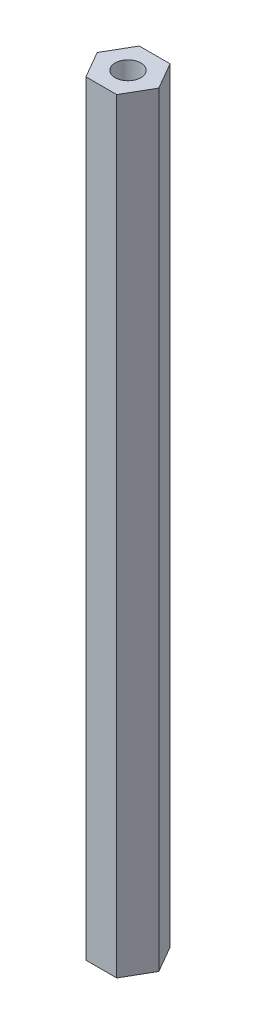
ISO-10303-21;
HEADER;
FILE_DESCRIPTION(('STEP AP214'),'2;1');
FILE_NAME('part.step','',(''),(''),'','','');
FILE_SCHEMA(('AUTOMOTIVE_DESIGN { 1 0 10303 214 1 1 1 1 }'));
ENDSEC;
DATA;
#1=APPLICATION_CONTEXT('core data for automotive mechanical design processes');
#2=APPLICATION_PROTOCOL_DEFINITION('international standard','automotive_design',2000,#1);
#3=PRODUCT_CONTEXT('',#1,'mechanical');
#4=PRODUCT('Part','Part','',(#3));
#5=PRODUCT_RELATED_PRODUCT_CATEGORY('part','',(#4));
#6=PRODUCT_DEFINITION_FORMATION('','',#4);
#7=PRODUCT_DEFINITION_CONTEXT('part definition',#1,'design');
#8=PRODUCT_DEFINITION('design','',#6,#7);
#9=PRODUCT_DEFINITION_SHAPE('','',#8);
#10=(LENGTH_UNIT() NAMED_UNIT(*) SI_UNIT(.MILLI.,.METRE.));
#11=(NAMED_UNIT(*) PLANE_ANGLE_UNIT() SI_UNIT($,.RADIAN.));
#12=(NAMED_UNIT(*) SI_UNIT($,.STERADIAN.) SOLID_ANGLE_UNIT());
#13=UNCERTAINTY_MEASURE_WITH_UNIT(LENGTH_MEASURE(1.E-05),#10,'distance_accuracy_value','');
#14=(GEOMETRIC_REPRESENTATION_CONTEXT(3) GLOBAL_UNCERTAINTY_ASSIGNED_CONTEXT((#13)) GLOBAL_UNIT_ASSIGNED_CONTEXT((#10,
#11,#12)) REPRESENTATION_CONTEXT('',''));
#15=CARTESIAN_POINT('',(0.,0.,0.));
#16=DIRECTION('',(0.,0.,1.));
#17=DIRECTION('',(1.,0.,0.));
#18=AXIS2_PLACEMENT_3D('',#15,#16,#17);
#19=CARTESIAN_POINT('',(3.,74.5,0.));
#20=DIRECTION('',(-0.866025403784439,0.,0.5));
#21=DIRECTION('',(0.5,0.,0.866025403784439));
#22=AXIS2_PLACEMENT_3D('',#19,#20,#21);
#23=PLANE('',#22);
#24=DIRECTION('',(-0.5,0.,-0.866025403784439));
#25=VECTOR('',#24,1.);
#26=CARTESIAN_POINT('',(3.,0.,0.));
#27=LINE('',#26,#25);
#28=CARTESIAN_POINT('',(3.,0.,0.));
#29=VERTEX_POINT('',#28);
#30=CARTESIAN_POINT('',(1.5,0.,-2.59807621135332));
#31=VERTEX_POINT('',#30);
#32=EDGE_CURVE('E128',#29,#31,#27,.T.);
#33=ORIENTED_EDGE('',*,*,#32,.T.);
#34=DIRECTION('',(0.,-1.,0.));
#35=VECTOR('',#34,1.);
#36=CARTESIAN_POINT('',(1.5,74.5,-2.59807621135332));
#37=LINE('',#36,#35);
#38=CARTESIAN_POINT('',(1.5,74.5,-2.59807621135332));
#39=VERTEX_POINT('',#38);
#40=EDGE_CURVE('E11',#39,#31,#37,.T.);
#41=ORIENTED_EDGE('',*,*,#40,.F.);
#42=DIRECTION('',(-0.5,0.,-0.866025403784439));
#43=VECTOR('',#42,1.);
#44=CARTESIAN_POINT('',(3.,74.5,0.));
#45=LINE('',#44,#43);
#46=CARTESIAN_POINT('',(3.,74.5,0.));
#47=VERTEX_POINT('',#46);
#48=EDGE_CURVE('E145',#47,#39,#45,.T.);
#49=ORIENTED_EDGE('',*,*,#48,.F.);
#50=DIRECTION('',(0.,-1.,0.));
#51=VECTOR('',#50,1.);
#52=CARTESIAN_POINT('',(3.,74.5,0.));
#53=LINE('',#52,#51);
#54=EDGE_CURVE('E124',#47,#29,#53,.T.);
#55=ORIENTED_EDGE('',*,*,#54,.T.);
#56=EDGE_LOOP('',(#33,#41,#49,#55));
#57=FACE_BOUND('',#56,.T.);
#58=ADVANCED_FACE('F39',(#57),#23,.F.);
#59=CARTESIAN_POINT('',(1.5,74.5,-2.59807621135332));
#60=DIRECTION('',(0.,0.,1.));
#61=DIRECTION('',(1.,0.,0.));
#62=AXIS2_PLACEMENT_3D('',#59,#60,#61);
#63=PLANE('',#62);
#64=DIRECTION('',(-1.,0.,0.));
#65=VECTOR('',#64,1.);
#66=CARTESIAN_POINT('',(1.5,0.,-2.59807621135332));
#67=LINE('',#66,#65);
#68=CARTESIAN_POINT('',(-1.5,0.,-2.59807621135332));
#69=VERTEX_POINT('',#68);
#70=EDGE_CURVE('E132',#31,#69,#67,.T.);
#71=ORIENTED_EDGE('',*,*,#70,.T.);
#72=DIRECTION('',(0.,-1.,0.));
#73=VECTOR('',#72,1.);
#74=CARTESIAN_POINT('',(-1.5,74.5,-2.59807621135332));
#75=LINE('',#74,#73);
#76=CARTESIAN_POINT('',(-1.5,74.5,-2.59807621135332));
#77=VERTEX_POINT('',#76);
#78=EDGE_CURVE('E48',#77,#69,#75,.T.);
#79=ORIENTED_EDGE('',*,*,#78,.F.);
#80=DIRECTION('',(-1.,0.,0.));
#81=VECTOR('',#80,1.);
#82=CARTESIAN_POINT('',(1.5,74.5,-2.59807621135332));
#83=LINE('',#82,#81);
#84=EDGE_CURVE('E93',#39,#77,#83,.T.);
#85=ORIENTED_EDGE('',*,*,#84,.F.);
#86=ORIENTED_EDGE('',*,*,#40,.T.);
#87=EDGE_LOOP('',(#71,#79,#85,#86));
#88=FACE_BOUND('',#87,.T.);
#89=ADVANCED_FACE('F174',(#88),#63,.F.);
#90=CARTESIAN_POINT('',(-1.5,74.5,-2.59807621135332));
#91=DIRECTION('',(0.866025403784439,0.,0.5));
#92=DIRECTION('',(0.5,0.,-0.866025403784439));
#93=AXIS2_PLACEMENT_3D('',#90,#91,#92);
#94=PLANE('',#93);
#95=DIRECTION('',(-0.5,0.,0.866025403784439));
#96=VECTOR('',#95,1.);
#97=CARTESIAN_POINT('',(-1.5,0.,-2.59807621135332));
#98=LINE('',#97,#96);
#99=CARTESIAN_POINT('',(-3.,0.,0.));
#100=VERTEX_POINT('',#99);
#101=EDGE_CURVE('E136',#69,#100,#98,.T.);
#102=ORIENTED_EDGE('',*,*,#101,.T.);
#103=DIRECTION('',(0.,-1.,0.));
#104=VECTOR('',#103,1.);
#105=CARTESIAN_POINT('',(-3.,74.5,0.));
#106=LINE('',#105,#104);
#107=CARTESIAN_POINT('',(-3.,74.5,0.));
#108=VERTEX_POINT('',#107);
#109=EDGE_CURVE('E117',#108,#100,#106,.T.);
#110=ORIENTED_EDGE('',*,*,#109,.F.);
#111=DIRECTION('',(-0.5,0.,0.866025403784439));
#112=VECTOR('',#111,1.);
#113=CARTESIAN_POINT('',(-1.5,74.5,-2.59807621135332));
#114=LINE('',#113,#112);
#115=EDGE_CURVE('E106',#77,#108,#114,.T.);
#116=ORIENTED_EDGE('',*,*,#115,.F.);
#117=ORIENTED_EDGE('',*,*,#78,.T.);
#118=EDGE_LOOP('',(#102,#110,#116,#117));
#119=FACE_BOUND('',#118,.T.);
#120=ADVANCED_FACE('F155',(#119),#94,.F.);
#121=CARTESIAN_POINT('',(-3.,74.5,0.));
#122=DIRECTION('',(0.866025403784439,0.,-0.5));
#123=DIRECTION('',(-0.5,0.,-0.866025403784439));
#124=AXIS2_PLACEMENT_3D('',#121,#122,#123);
#125=PLANE('',#124);
#126=DIRECTION('',(0.5,0.,0.866025403784439));
#127=VECTOR('',#126,1.);
#128=CARTESIAN_POINT('',(-3.,0.,0.));
#129=LINE('',#128,#127);
#130=CARTESIAN_POINT('',(-1.5,0.,2.59807621135332));
#131=VERTEX_POINT('',#130);
#132=EDGE_CURVE('E115',#100,#131,#129,.T.);
#133=ORIENTED_EDGE('',*,*,#132,.T.);
#134=DIRECTION('',(0.,-1.,0.));
#135=VECTOR('',#134,1.);
#136=CARTESIAN_POINT('',(-1.5,74.5,2.59807621135332));
#137=LINE('',#136,#135);
#138=CARTESIAN_POINT('',(-1.5,74.5,2.59807621135332));
#139=VERTEX_POINT('',#138);
#140=EDGE_CURVE('E112',#139,#131,#137,.T.);
#141=ORIENTED_EDGE('',*,*,#140,.F.);
#142=DIRECTION('',(0.5,0.,0.866025403784439));
#143=VECTOR('',#142,1.);
#144=CARTESIAN_POINT('',(-3.,74.5,0.));
#145=LINE('',#144,#143);
#146=EDGE_CURVE('E100',#108,#139,#145,.T.);
#147=ORIENTED_EDGE('',*,*,#146,.F.);
#148=ORIENTED_EDGE('',*,*,#109,.T.);
#149=EDGE_LOOP('',(#133,#141,#147,#148));
#150=FACE_BOUND('',#149,.T.);
#151=ADVANCED_FACE('F113',(#150),#125,.F.);
#152=CARTESIAN_POINT('',(-1.5,74.5,2.59807621135332));
#153=DIRECTION('',(0.,0.,-1.));
#154=DIRECTION('',(-1.,0.,0.));
#155=AXIS2_PLACEMENT_3D('',#152,#153,#154);
#156=PLANE('',#155);
#157=DIRECTION('',(1.,0.,0.));
#158=VECTOR('',#157,1.);
#159=CARTESIAN_POINT('',(-1.5,0.,2.59807621135332));
#160=LINE('',#159,#158);
#161=CARTESIAN_POINT('',(1.5,0.,2.59807621135332));
#162=VERTEX_POINT('',#161);
#163=EDGE_CURVE('E79',#131,#162,#160,.T.);
#164=ORIENTED_EDGE('',*,*,#163,.T.);
#165=DIRECTION('',(0.,-1.,0.));
#166=VECTOR('',#165,1.);
#167=CARTESIAN_POINT('',(1.5,74.5,2.59807621135332));
#168=LINE('',#167,#166);
#169=CARTESIAN_POINT('',(1.5,74.5,2.59807621135332));
#170=VERTEX_POINT('',#169);
#171=EDGE_CURVE('E118',#170,#162,#168,.T.);
#172=ORIENTED_EDGE('',*,*,#171,.F.);
#173=DIRECTION('',(1.,0.,0.));
#174=VECTOR('',#173,1.);
#175=CARTESIAN_POINT('',(-1.5,74.5,2.59807621135332));
#176=LINE('',#175,#174);
#177=EDGE_CURVE('E104',#139,#170,#176,.T.);
#178=ORIENTED_EDGE('',*,*,#177,.F.);
#179=ORIENTED_EDGE('',*,*,#140,.T.);
#180=EDGE_LOOP('',(#164,#172,#178,#179));
#181=FACE_BOUND('',#180,.T.);
#182=ADVANCED_FACE('F120',(#181),#156,.F.);
#183=CARTESIAN_POINT('',(1.5,74.5,2.59807621135332));
#184=DIRECTION('',(-0.866025403784439,0.,-0.5));
#185=DIRECTION('',(-0.5,0.,0.866025403784439));
#186=AXIS2_PLACEMENT_3D('',#183,#184,#185);
#187=PLANE('',#186);
#188=DIRECTION('',(0.5,0.,-0.866025403784439));
#189=VECTOR('',#188,1.);
#190=CARTESIAN_POINT('',(1.5,0.,2.59807621135332));
#191=LINE('',#190,#189);
#192=EDGE_CURVE('E85',#162,#29,#191,.T.);
#193=ORIENTED_EDGE('',*,*,#192,.T.);
#194=ORIENTED_EDGE('',*,*,#54,.F.);
#195=DIRECTION('',(0.5,0.,-0.866025403784439));
#196=VECTOR('',#195,1.);
#197=CARTESIAN_POINT('',(1.5,74.5,2.59807621135332));
#198=LINE('',#197,#196);
#199=EDGE_CURVE('E56',#170,#47,#198,.T.);
#200=ORIENTED_EDGE('',*,*,#199,.F.);
#201=ORIENTED_EDGE('',*,*,#171,.T.);
#202=EDGE_LOOP('',(#193,#194,#200,#201));
#203=FACE_BOUND('',#202,.T.);
#204=ADVANCED_FACE('F162',(#203),#187,.F.);
#205=CARTESIAN_POINT('',(0.,74.5,0.));
#206=DIRECTION('',(0.,1.,0.));
#207=DIRECTION('',(0.,0.,1.));
#208=AXIS2_PLACEMENT_3D('',#205,#206,#207);
#209=PLANE('',#208);
#210=CARTESIAN_POINT('',(0.,74.5,0.));
#211=DIRECTION('',(0.,1.,0.));
#212=DIRECTION('',(0.,0.,1.));
#213=AXIS2_PLACEMENT_3D('',#210,#211,#212);
#214=CIRCLE('',#213,1.25);
#215=CARTESIAN_POINT('',(0.,74.5,1.25));
#216=VERTEX_POINT('',#215);
#217=EDGE_CURVE('E229',#216,#216,#214,.T.);
#218=ORIENTED_EDGE('',*,*,#217,.F.);
#219=EDGE_LOOP('',(#218));
#220=FACE_BOUND('',#219,.T.);
#221=ORIENTED_EDGE('',*,*,#48,.T.);
#222=ORIENTED_EDGE('',*,*,#84,.T.);
#223=ORIENTED_EDGE('',*,*,#115,.T.);
#224=ORIENTED_EDGE('',*,*,#146,.T.);
#225=ORIENTED_EDGE('',*,*,#177,.T.);
#226=ORIENTED_EDGE('',*,*,#199,.T.);
#227=EDGE_LOOP('',(#221,#222,#223,#224,#225,#226));
#228=FACE_BOUND('',#227,.T.);
#229=ADVANCED_FACE('F102',(#220,#228),#209,.T.);
#230=CARTESIAN_POINT('',(0.,0.,0.));
#231=DIRECTION('',(0.,1.,0.));
#232=DIRECTION('',(0.,0.,1.));
#233=AXIS2_PLACEMENT_3D('',#230,#231,#232);
#234=PLANE('',#233);
#235=CARTESIAN_POINT('',(0.,0.,0.));
#236=DIRECTION('',(0.,1.,0.));
#237=DIRECTION('',(0.,0.,1.));
#238=AXIS2_PLACEMENT_3D('',#235,#236,#237);
#239=CIRCLE('',#238,1.25);
#240=CARTESIAN_POINT('',(0.,0.,1.25));
#241=VERTEX_POINT('',#240);
#242=EDGE_CURVE('E133',#241,#241,#239,.T.);
#243=ORIENTED_EDGE('',*,*,#242,.T.);
#244=EDGE_LOOP('',(#243));
#245=FACE_BOUND('',#244,.T.);
#246=ORIENTED_EDGE('',*,*,#32,.F.);
#247=ORIENTED_EDGE('',*,*,#192,.F.);
#248=ORIENTED_EDGE('',*,*,#163,.F.);
#249=ORIENTED_EDGE('',*,*,#132,.F.);
#250=ORIENTED_EDGE('',*,*,#101,.F.);
#251=ORIENTED_EDGE('',*,*,#70,.F.);
#252=EDGE_LOOP('',(#246,#247,#248,#249,#250,#251));
#253=FACE_BOUND('',#252,.T.);
#254=ADVANCED_FACE('F158',(#245,#253),#234,.F.);
#255=CARTESIAN_POINT('',(0.,0.,0.));
#256=DIRECTION('',(0.,1.,0.));
#257=DIRECTION('',(0.,0.,1.));
#258=AXIS2_PLACEMENT_3D('',#255,#256,#257);
#259=CYLINDRICAL_SURFACE('',#258,1.25);
#260=ORIENTED_EDGE('',*,*,#242,.F.);
#261=EDGE_LOOP('',(#260));
#262=FACE_BOUND('',#261,.T.);
#263=ORIENTED_EDGE('',*,*,#217,.T.);
#264=EDGE_LOOP('',(#263));
#265=FACE_BOUND('',#264,.T.);
#266=ADVANCED_FACE('F211',(#262,#265),#259,.F.);
#267=CLOSED_SHELL('',(#58,#89,#120,#151,#182,#204,#229,#254,#266));
#268=MANIFOLD_SOLID_BREP('B2',#267);
#269=ADVANCED_BREP_SHAPE_REPRESENTATION('',(#18,#268),#14);
#270=SHAPE_DEFINITION_REPRESENTATION(#9,#269);
ENDSEC;
END-ISO-10303-21;
